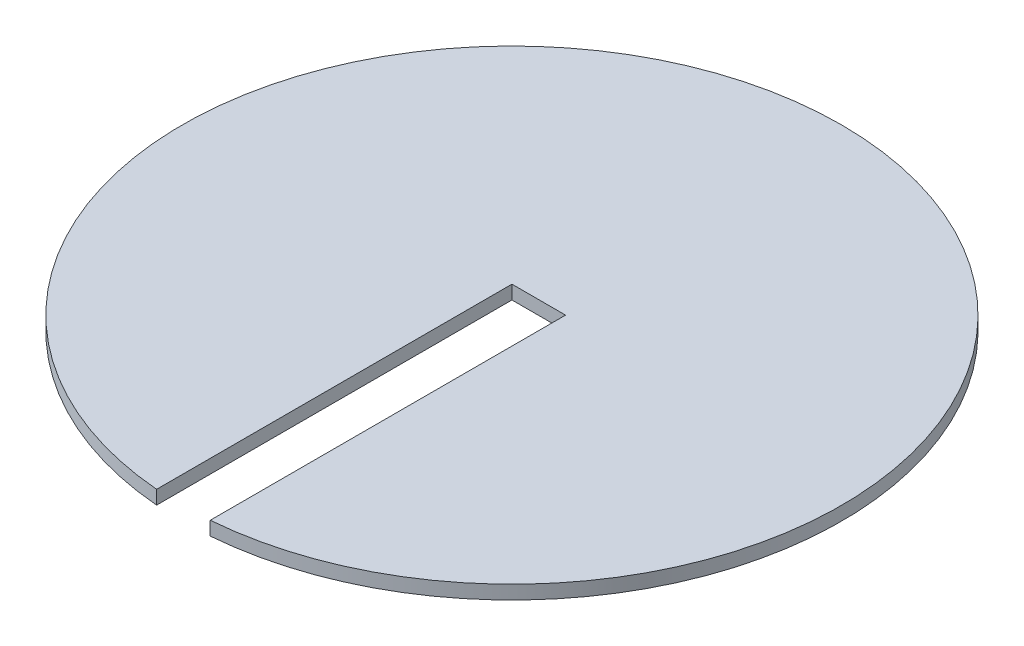
ISO-10303-21;
HEADER;
FILE_DESCRIPTION(('STEP AP214'),'2;1');
FILE_NAME('part.step','',(''),(''),'','','');
FILE_SCHEMA(('AUTOMOTIVE_DESIGN { 1 0 10303 214 1 1 1 1 }'));
ENDSEC;
DATA;
#1=APPLICATION_CONTEXT('core data for automotive mechanical design processes');
#2=APPLICATION_PROTOCOL_DEFINITION('international standard','automotive_design',2000,#1);
#3=PRODUCT_CONTEXT('',#1,'mechanical');
#4=PRODUCT('Part','Part','',(#3));
#5=PRODUCT_RELATED_PRODUCT_CATEGORY('part','',(#4));
#6=PRODUCT_DEFINITION_FORMATION('','',#4);
#7=PRODUCT_DEFINITION_CONTEXT('part definition',#1,'design');
#8=PRODUCT_DEFINITION('design','',#6,#7);
#9=PRODUCT_DEFINITION_SHAPE('','',#8);
#10=(LENGTH_UNIT() NAMED_UNIT(*) SI_UNIT(.MILLI.,.METRE.));
#11=(NAMED_UNIT(*) PLANE_ANGLE_UNIT() SI_UNIT($,.RADIAN.));
#12=(NAMED_UNIT(*) SI_UNIT($,.STERADIAN.) SOLID_ANGLE_UNIT());
#13=UNCERTAINTY_MEASURE_WITH_UNIT(LENGTH_MEASURE(1.E-05),#10,'distance_accuracy_value','');
#14=(GEOMETRIC_REPRESENTATION_CONTEXT(3) GLOBAL_UNCERTAINTY_ASSIGNED_CONTEXT((#13)) GLOBAL_UNIT_ASSIGNED_CONTEXT((#10,
#11,#12)) REPRESENTATION_CONTEXT('',''));
#15=CARTESIAN_POINT('',(0.,0.,0.));
#16=DIRECTION('',(0.,0.,1.));
#17=DIRECTION('',(1.,0.,0.));
#18=AXIS2_PLACEMENT_3D('',#15,#16,#17);
#19=CARTESIAN_POINT('',(8.60849517111807,1.5875,-8.14858922292322));
#20=DIRECTION('',(0.,0.,-1.));
#21=DIRECTION('',(-1.,0.,0.));
#22=AXIS2_PLACEMENT_3D('',#19,#20,#21);
#23=PLANE('',#22);
#24=DIRECTION('',(1.,0.,0.));
#25=VECTOR('',#24,1.);
#26=CARTESIAN_POINT('',(8.60849517111807,0.,-8.14858922292322));
#27=LINE('',#26,#25);
#28=CARTESIAN_POINT('',(2.40849517111807,0.,-8.14858922292322));
#29=VERTEX_POINT('',#28);
#30=CARTESIAN_POINT('',(8.60849517111807,0.,-8.14858922292322));
#31=VERTEX_POINT('',#30);
#32=EDGE_CURVE('E87',#29,#31,#27,.T.);
#33=ORIENTED_EDGE('',*,*,#32,.T.);
#34=DIRECTION('',(0.,-1.,0.));
#35=VECTOR('',#34,1.);
#36=CARTESIAN_POINT('',(8.60849517111807,1.5875,-8.14858922292322));
#37=LINE('',#36,#35);
#38=CARTESIAN_POINT('',(8.60849517111807,1.5875,-8.14858922292322));
#39=VERTEX_POINT('',#38);
#40=EDGE_CURVE('E41',#39,#31,#37,.T.);
#41=ORIENTED_EDGE('',*,*,#40,.F.);
#42=DIRECTION('',(1.,0.,0.));
#43=VECTOR('',#42,1.);
#44=CARTESIAN_POINT('',(8.60849517111807,1.5875,-8.14858922292322));
#45=LINE('',#44,#43);
#46=CARTESIAN_POINT('',(2.40849517111807,1.5875,-8.14858922292322));
#47=VERTEX_POINT('',#46);
#48=EDGE_CURVE('E79',#47,#39,#45,.T.);
#49=ORIENTED_EDGE('',*,*,#48,.F.);
#50=DIRECTION('',(0.,-1.,0.));
#51=VECTOR('',#50,1.);
#52=CARTESIAN_POINT('',(2.40849517111807,1.5875,-8.14858922292322));
#53=LINE('',#52,#51);
#54=EDGE_CURVE('E11',#47,#29,#53,.T.);
#55=ORIENTED_EDGE('',*,*,#54,.T.);
#56=EDGE_LOOP('',(#33,#41,#49,#55));
#57=FACE_BOUND('',#56,.T.);
#58=ADVANCED_FACE('F33',(#57),#23,.F.);
#59=CARTESIAN_POINT('',(8.60849517111807,1.5875,-1.94858922292322));
#60=DIRECTION('',(1.,0.,0.));
#61=DIRECTION('',(0.,0.,-1.));
#62=AXIS2_PLACEMENT_3D('',#59,#60,#61);
#63=PLANE('',#62);
#64=DIRECTION('',(0.,0.,1.));
#65=VECTOR('',#64,1.);
#66=CARTESIAN_POINT('',(8.60849517111807,0.,-1.94858922292322));
#67=LINE('',#66,#65);
#68=CARTESIAN_POINT('',(8.60849517111808,0.,32.9250858691718));
#69=VERTEX_POINT('',#68);
#70=EDGE_CURVE('E66',#31,#69,#67,.T.);
#71=ORIENTED_EDGE('',*,*,#70,.T.);
#72=DIRECTION('',(0.,-1.,0.));
#73=VECTOR('',#72,1.);
#74=CARTESIAN_POINT('',(8.60849517111808,1.5875,32.9250858691718));
#75=LINE('',#74,#73);
#76=CARTESIAN_POINT('',(8.60849517111808,1.5875,32.9250858691718));
#77=VERTEX_POINT('',#76);
#78=EDGE_CURVE('E88',#77,#69,#75,.T.);
#79=ORIENTED_EDGE('',*,*,#78,.F.);
#80=DIRECTION('',(0.,0.,1.));
#81=VECTOR('',#80,1.);
#82=CARTESIAN_POINT('',(8.60849517111807,1.5875,-8.14858922292322));
#83=LINE('',#82,#81);
#84=EDGE_CURVE('E83',#39,#77,#83,.T.);
#85=ORIENTED_EDGE('',*,*,#84,.F.);
#86=ORIENTED_EDGE('',*,*,#40,.T.);
#87=EDGE_LOOP('',(#71,#79,#85,#86));
#88=FACE_BOUND('',#87,.T.);
#89=ADVANCED_FACE('F89',(#88),#63,.F.);
#90=CARTESIAN_POINT('',(5.50849517111807,1.5875,-5.04858922292322));
#91=DIRECTION('',(0.,-1.,0.));
#92=DIRECTION('',(0.,0.,-1.));
#93=AXIS2_PLACEMENT_3D('',#90,#91,#92);
#94=CYLINDRICAL_SURFACE('',#93,38.1);
#95=CARTESIAN_POINT('',(5.50849517111807,0.,-5.04858922292322));
#96=DIRECTION('',(0.,1.,0.));
#97=DIRECTION('',(0.,0.,1.));
#98=AXIS2_PLACEMENT_3D('',#95,#96,#97);
#99=CIRCLE('',#98,38.1);
#100=CARTESIAN_POINT('',(2.40849517111808,0.,32.9250858691718));
#101=VERTEX_POINT('',#100);
#102=EDGE_CURVE('E73',#69,#101,#99,.T.);
#103=ORIENTED_EDGE('',*,*,#102,.T.);
#104=DIRECTION('',(0.,-1.,0.));
#105=VECTOR('',#104,1.);
#106=CARTESIAN_POINT('',(2.40849517111808,1.5875,32.9250858691718));
#107=LINE('',#106,#105);
#108=CARTESIAN_POINT('',(2.40849517111808,1.5875,32.9250858691718));
#109=VERTEX_POINT('',#108);
#110=EDGE_CURVE('E93',#109,#101,#107,.T.);
#111=ORIENTED_EDGE('',*,*,#110,.F.);
#112=CARTESIAN_POINT('',(5.50849517111807,1.5875,-5.04858922292322));
#113=DIRECTION('',(0.,1.,0.));
#114=DIRECTION('',(0.,0.,1.));
#115=AXIS2_PLACEMENT_3D('',#112,#113,#114);
#116=CIRCLE('',#115,38.1);
#117=EDGE_CURVE('E91',#77,#109,#116,.T.);
#118=ORIENTED_EDGE('',*,*,#117,.F.);
#119=ORIENTED_EDGE('',*,*,#78,.T.);
#120=EDGE_LOOP('',(#103,#111,#118,#119));
#121=FACE_BOUND('',#120,.T.);
#122=ADVANCED_FACE('F103',(#121),#94,.T.);
#123=CARTESIAN_POINT('',(2.40849517111807,1.5875,-1.94858922292322));
#124=DIRECTION('',(-1.,0.,0.));
#125=DIRECTION('',(0.,0.,1.));
#126=AXIS2_PLACEMENT_3D('',#123,#124,#125);
#127=PLANE('',#126);
#128=DIRECTION('',(0.,0.,-1.));
#129=VECTOR('',#128,1.);
#130=CARTESIAN_POINT('',(2.40849517111807,0.,-1.94858922292322));
#131=LINE('',#130,#129);
#132=EDGE_CURVE('E100',#101,#29,#131,.T.);
#133=ORIENTED_EDGE('',*,*,#132,.T.);
#134=ORIENTED_EDGE('',*,*,#54,.F.);
#135=DIRECTION('',(0.,0.,-1.));
#136=VECTOR('',#135,1.);
#137=CARTESIAN_POINT('',(2.40849517111807,1.5875,-8.14858922292322));
#138=LINE('',#137,#136);
#139=EDGE_CURVE('E49',#109,#47,#138,.T.);
#140=ORIENTED_EDGE('',*,*,#139,.F.);
#141=ORIENTED_EDGE('',*,*,#110,.T.);
#142=EDGE_LOOP('',(#133,#134,#140,#141));
#143=FACE_BOUND('',#142,.T.);
#144=ADVANCED_FACE('F107',(#143),#127,.F.);
#145=CARTESIAN_POINT('',(5.50849517111807,1.5875,-5.04858922292322));
#146=DIRECTION('',(0.,1.,0.));
#147=DIRECTION('',(0.,0.,1.));
#148=AXIS2_PLACEMENT_3D('',#145,#146,#147);
#149=PLANE('',#148);
#150=ORIENTED_EDGE('',*,*,#139,.T.);
#151=ORIENTED_EDGE('',*,*,#48,.T.);
#152=ORIENTED_EDGE('',*,*,#84,.T.);
#153=ORIENTED_EDGE('',*,*,#117,.T.);
#154=EDGE_LOOP('',(#150,#151,#152,#153));
#155=FACE_BOUND('',#154,.T.);
#156=ADVANCED_FACE('F81',(#155),#149,.T.);
#157=CARTESIAN_POINT('',(5.50849517111807,0.,-5.04858922292322));
#158=DIRECTION('',(0.,1.,0.));
#159=DIRECTION('',(0.,0.,1.));
#160=AXIS2_PLACEMENT_3D('',#157,#158,#159);
#161=PLANE('',#160);
#162=ORIENTED_EDGE('',*,*,#32,.F.);
#163=ORIENTED_EDGE('',*,*,#132,.F.);
#164=ORIENTED_EDGE('',*,*,#102,.F.);
#165=ORIENTED_EDGE('',*,*,#70,.F.);
#166=EDGE_LOOP('',(#162,#163,#164,#165));
#167=FACE_BOUND('',#166,.T.);
#168=ADVANCED_FACE('F106',(#167),#161,.F.);
#169=CLOSED_SHELL('',(#58,#89,#122,#144,#156,#168));
#170=MANIFOLD_SOLID_BREP('B2',#169);
#171=ADVANCED_BREP_SHAPE_REPRESENTATION('',(#18,#170),#14);
#172=SHAPE_DEFINITION_REPRESENTATION(#9,#171);
ENDSEC;
END-ISO-10303-21;
